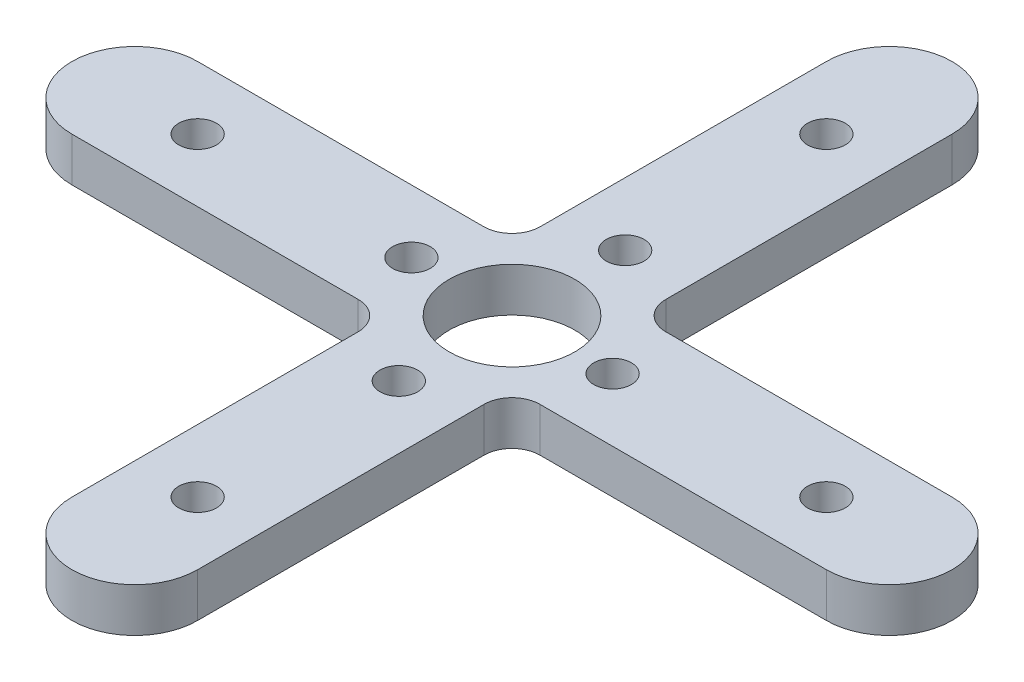
ISO-10303-21;
HEADER;
FILE_DESCRIPTION(('STEP AP214'),'2;1');
FILE_NAME('part.step','',(''),(''),'','','');
FILE_SCHEMA(('AUTOMOTIVE_DESIGN { 1 0 10303 214 1 1 1 1 }'));
ENDSEC;
DATA;
#1=APPLICATION_CONTEXT('core data for automotive mechanical design processes');
#2=APPLICATION_PROTOCOL_DEFINITION('international standard','automotive_design',2000,#1);
#3=PRODUCT_CONTEXT('',#1,'mechanical');
#4=PRODUCT('Part','Part','',(#3));
#5=PRODUCT_RELATED_PRODUCT_CATEGORY('part','',(#4));
#6=PRODUCT_DEFINITION_FORMATION('','',#4);
#7=PRODUCT_DEFINITION_CONTEXT('part definition',#1,'design');
#8=PRODUCT_DEFINITION('design','',#6,#7);
#9=PRODUCT_DEFINITION_SHAPE('','',#8);
#10=(LENGTH_UNIT() NAMED_UNIT(*) SI_UNIT(.MILLI.,.METRE.));
#11=(NAMED_UNIT(*) PLANE_ANGLE_UNIT() SI_UNIT($,.RADIAN.));
#12=(NAMED_UNIT(*) SI_UNIT($,.STERADIAN.) SOLID_ANGLE_UNIT());
#13=UNCERTAINTY_MEASURE_WITH_UNIT(LENGTH_MEASURE(1.E-05),#10,'distance_accuracy_value','');
#14=(GEOMETRIC_REPRESENTATION_CONTEXT(3) GLOBAL_UNCERTAINTY_ASSIGNED_CONTEXT((#13)) GLOBAL_UNIT_ASSIGNED_CONTEXT((#10,
#11,#12)) REPRESENTATION_CONTEXT('',''));
#15=CARTESIAN_POINT('',(0.,0.,0.));
#16=DIRECTION('',(0.,0.,1.));
#17=DIRECTION('',(1.,0.,0.));
#18=AXIS2_PLACEMENT_3D('',#15,#16,#17);
#19=CARTESIAN_POINT('',(1.47572531971469,3.5,0.));
#20=DIRECTION('',(1.,0.,0.));
#21=DIRECTION('',(0.,0.,-1.));
#22=AXIS2_PLACEMENT_3D('',#19,#20,#21);
#23=PLANE('',#22);
#24=DIRECTION('',(0.,0.,1.));
#25=VECTOR('',#24,1.);
#26=CARTESIAN_POINT('',(1.47572531971469,0.,0.));
#27=LINE('',#26,#25);
#28=CARTESIAN_POINT('',(1.47572531971468,0.,10.7886740611654));
#29=VERTEX_POINT('',#28);
#30=CARTESIAN_POINT('',(1.47572531971468,0.,33.5464556338722));
#31=VERTEX_POINT('',#30);
#32=EDGE_CURVE('E211',#29,#31,#27,.T.);
#33=ORIENTED_EDGE('',*,*,#32,.T.);
#34=DIRECTION('',(0.,-1.,0.));
#35=VECTOR('',#34,1.);
#36=CARTESIAN_POINT('',(1.47572531971468,3.5,33.5464556338722));
#37=LINE('',#36,#35);
#38=CARTESIAN_POINT('',(1.47572531971468,3.5,33.5464556338722));
#39=VERTEX_POINT('',#38);
#40=EDGE_CURVE('E11',#39,#31,#37,.T.);
#41=ORIENTED_EDGE('',*,*,#40,.F.);
#42=DIRECTION('',(0.,0.,1.));
#43=VECTOR('',#42,1.);
#44=CARTESIAN_POINT('',(1.47572531971469,3.5,0.));
#45=LINE('',#44,#43);
#46=CARTESIAN_POINT('',(1.47572531971468,3.5,10.7886740611654));
#47=VERTEX_POINT('',#46);
#48=EDGE_CURVE('E325',#47,#39,#45,.T.);
#49=ORIENTED_EDGE('',*,*,#48,.F.);
#50=DIRECTION('',(0.,-1.,0.));
#51=VECTOR('',#50,1.);
#52=CARTESIAN_POINT('',(1.47572531971468,3.5,10.7886740611654));
#53=LINE('',#52,#51);
#54=EDGE_CURVE('E180',#47,#29,#53,.T.);
#55=ORIENTED_EDGE('',*,*,#54,.T.);
#56=EDGE_LOOP('',(#33,#41,#49,#55));
#57=FACE_BOUND('',#56,.T.);
#58=ADVANCED_FACE('F39',(#57),#23,.F.);
#59=CARTESIAN_POINT('',(6.47572531971468,3.5,33.5464556338722));
#60=DIRECTION('',(0.,-1.,0.));
#61=DIRECTION('',(0.,0.,-1.));
#62=AXIS2_PLACEMENT_3D('',#59,#60,#61);
#63=CYLINDRICAL_SURFACE('',#62,5.);
#64=CARTESIAN_POINT('',(6.47572531971468,0.,33.5464556338722));
#65=DIRECTION('',(0.,1.,0.));
#66=DIRECTION('',(0.,0.,1.));
#67=AXIS2_PLACEMENT_3D('',#64,#65,#66);
#68=CIRCLE('',#67,5.);
#69=CARTESIAN_POINT('',(11.4757253197147,0.,33.5464556338722));
#70=VERTEX_POINT('',#69);
#71=EDGE_CURVE('E214',#31,#70,#68,.T.);
#72=ORIENTED_EDGE('',*,*,#71,.T.);
#73=DIRECTION('',(0.,-1.,0.));
#74=VECTOR('',#73,1.);
#75=CARTESIAN_POINT('',(11.4757253197147,3.5,33.5464556338722));
#76=LINE('',#75,#74);
#77=CARTESIAN_POINT('',(11.4757253197147,3.5,33.5464556338722));
#78=VERTEX_POINT('',#77);
#79=EDGE_CURVE('E48',#78,#70,#76,.T.);
#80=ORIENTED_EDGE('',*,*,#79,.F.);
#81=CARTESIAN_POINT('',(6.47572531971468,3.5,33.5464556338722));
#82=DIRECTION('',(0.,1.,0.));
#83=DIRECTION('',(0.,0.,1.));
#84=AXIS2_PLACEMENT_3D('',#81,#82,#83);
#85=CIRCLE('',#84,5.);
#86=EDGE_CURVE('E123',#39,#78,#85,.T.);
#87=ORIENTED_EDGE('',*,*,#86,.F.);
#88=ORIENTED_EDGE('',*,*,#40,.T.);
#89=EDGE_LOOP('',(#72,#80,#87,#88));
#90=FACE_BOUND('',#89,.T.);
#91=ADVANCED_FACE('F340',(#90),#63,.T.);
#92=CARTESIAN_POINT('',(11.4757253197147,3.5,0.));
#93=DIRECTION('',(-1.,0.,0.));
#94=DIRECTION('',(0.,0.,1.));
#95=AXIS2_PLACEMENT_3D('',#92,#93,#94);
#96=PLANE('',#95);
#97=DIRECTION('',(0.,0.,-1.));
#98=VECTOR('',#97,1.);
#99=CARTESIAN_POINT('',(11.4757253197147,0.,0.));
#100=LINE('',#99,#98);
#101=CARTESIAN_POINT('',(11.4757253197147,0.,10.7886740611654));
#102=VERTEX_POINT('',#101);
#103=EDGE_CURVE('E216',#70,#102,#100,.T.);
#104=ORIENTED_EDGE('',*,*,#103,.T.);
#105=DIRECTION('',(0.,-1.,0.));
#106=VECTOR('',#105,1.);
#107=CARTESIAN_POINT('',(11.4757253197147,3.5,10.7886740611654));
#108=LINE('',#107,#106);
#109=CARTESIAN_POINT('',(11.4757253197147,3.5,10.7886740611654));
#110=VERTEX_POINT('',#109);
#111=EDGE_CURVE('E274',#110,#102,#108,.T.);
#112=ORIENTED_EDGE('',*,*,#111,.F.);
#113=DIRECTION('',(0.,0.,-1.));
#114=VECTOR('',#113,1.);
#115=CARTESIAN_POINT('',(11.4757253197147,3.5,0.));
#116=LINE('',#115,#114);
#117=EDGE_CURVE('E281',#78,#110,#116,.T.);
#118=ORIENTED_EDGE('',*,*,#117,.F.);
#119=ORIENTED_EDGE('',*,*,#79,.T.);
#120=EDGE_LOOP('',(#104,#112,#118,#119));
#121=FACE_BOUND('',#120,.T.);
#122=ADVANCED_FACE('F279',(#121),#96,.F.);
#123=CARTESIAN_POINT('',(13.6976972523665,3.5,10.7685189761164));
#124=DIRECTION('',(0.,-1.,0.));
#125=DIRECTION('',(0.,0.,-1.));
#126=AXIS2_PLACEMENT_3D('',#123,#124,#125);
#127=CYLINDRICAL_SURFACE('',#126,2.22206334224426);
#128=CARTESIAN_POINT('',(13.6976972523665,0.,10.7685189761164));
#129=DIRECTION('',(0.,1.,0.));
#130=DIRECTION('',(0.,0.,1.));
#131=AXIS2_PLACEMENT_3D('',#128,#129,#130);
#132=CIRCLE('',#131,2.22206334224426);
#133=CARTESIAN_POINT('',(13.6976972523665,0.,8.54645563387217));
#134=VERTEX_POINT('',#133);
#135=EDGE_CURVE('E219',#134,#102,#132,.T.);
#136=ORIENTED_EDGE('',*,*,#135,.F.);
#137=DIRECTION('',(0.,-1.,0.));
#138=VECTOR('',#137,1.);
#139=CARTESIAN_POINT('',(13.6976972523665,3.5,8.54645563387217));
#140=LINE('',#139,#138);
#141=CARTESIAN_POINT('',(13.6976972523665,3.5,8.54645563387217));
#142=VERTEX_POINT('',#141);
#143=EDGE_CURVE('E272',#142,#134,#140,.T.);
#144=ORIENTED_EDGE('',*,*,#143,.F.);
#145=CARTESIAN_POINT('',(13.6976972523665,3.5,10.7685189761164));
#146=DIRECTION('',(0.,1.,0.));
#147=DIRECTION('',(0.,0.,1.));
#148=AXIS2_PLACEMENT_3D('',#145,#146,#147);
#149=CIRCLE('',#148,2.22206334224426);
#150=EDGE_CURVE('E293',#142,#110,#149,.T.);
#151=ORIENTED_EDGE('',*,*,#150,.T.);
#152=ORIENTED_EDGE('',*,*,#111,.T.);
#153=EDGE_LOOP('',(#136,#144,#151,#152));
#154=FACE_BOUND('',#153,.T.);
#155=ADVANCED_FACE('F289',(#154),#127,.F.);
#156=CARTESIAN_POINT('',(0.,3.5,8.54645563387217));
#157=DIRECTION('',(0.,0.,-1.));
#158=DIRECTION('',(-1.,0.,0.));
#159=AXIS2_PLACEMENT_3D('',#156,#157,#158);
#160=PLANE('',#159);
#161=DIRECTION('',(1.,0.,0.));
#162=VECTOR('',#161,1.);
#163=CARTESIAN_POINT('',(0.,0.,8.54645563387217));
#164=LINE('',#163,#162);
#165=CARTESIAN_POINT('',(36.4757253197147,0.,8.54645563387217));
#166=VERTEX_POINT('',#165);
#167=EDGE_CURVE('E222',#134,#166,#164,.T.);
#168=ORIENTED_EDGE('',*,*,#167,.T.);
#169=DIRECTION('',(0.,-1.,0.));
#170=VECTOR('',#169,1.);
#171=CARTESIAN_POINT('',(36.4757253197147,3.5,8.54645563387217));
#172=LINE('',#171,#170);
#173=CARTESIAN_POINT('',(36.4757253197147,3.5,8.54645563387217));
#174=VERTEX_POINT('',#173);
#175=EDGE_CURVE('E269',#174,#166,#172,.T.);
#176=ORIENTED_EDGE('',*,*,#175,.F.);
#177=DIRECTION('',(1.,0.,0.));
#178=VECTOR('',#177,1.);
#179=CARTESIAN_POINT('',(0.,3.5,8.54645563387217));
#180=LINE('',#179,#178);
#181=EDGE_CURVE('E294',#142,#174,#180,.T.);
#182=ORIENTED_EDGE('',*,*,#181,.F.);
#183=ORIENTED_EDGE('',*,*,#143,.T.);
#184=EDGE_LOOP('',(#168,#176,#182,#183));
#185=FACE_BOUND('',#184,.T.);
#186=ADVANCED_FACE('F566',(#185),#160,.F.);
#187=CARTESIAN_POINT('',(36.4757253197147,3.5,3.54645563387217));
#188=DIRECTION('',(0.,-1.,0.));
#189=DIRECTION('',(0.,0.,-1.));
#190=AXIS2_PLACEMENT_3D('',#187,#188,#189);
#191=CYLINDRICAL_SURFACE('',#190,5.);
#192=CARTESIAN_POINT('',(36.4757253197147,0.,3.54645563387217));
#193=DIRECTION('',(0.,1.,0.));
#194=DIRECTION('',(0.,0.,1.));
#195=AXIS2_PLACEMENT_3D('',#192,#193,#194);
#196=CIRCLE('',#195,5.);
#197=CARTESIAN_POINT('',(36.4757253197147,0.,-1.45354436612783));
#198=VERTEX_POINT('',#197);
#199=EDGE_CURVE('E224',#166,#198,#196,.T.);
#200=ORIENTED_EDGE('',*,*,#199,.T.);
#201=DIRECTION('',(0.,-1.,0.));
#202=VECTOR('',#201,1.);
#203=CARTESIAN_POINT('',(36.4757253197147,3.5,-1.45354436612783));
#204=LINE('',#203,#202);
#205=CARTESIAN_POINT('',(36.4757253197147,3.5,-1.45354436612783));
#206=VERTEX_POINT('',#205);
#207=EDGE_CURVE('E267',#206,#198,#204,.T.);
#208=ORIENTED_EDGE('',*,*,#207,.F.);
#209=CARTESIAN_POINT('',(36.4757253197147,3.5,3.54645563387217));
#210=DIRECTION('',(0.,1.,0.));
#211=DIRECTION('',(0.,0.,1.));
#212=AXIS2_PLACEMENT_3D('',#209,#210,#211);
#213=CIRCLE('',#212,5.);
#214=EDGE_CURVE('E296',#174,#206,#213,.T.);
#215=ORIENTED_EDGE('',*,*,#214,.F.);
#216=ORIENTED_EDGE('',*,*,#175,.T.);
#217=EDGE_LOOP('',(#200,#208,#215,#216));
#218=FACE_BOUND('',#217,.T.);
#219=ADVANCED_FACE('F556',(#218),#191,.T.);
#220=CARTESIAN_POINT('',(0.,3.5,-1.45354436612783));
#221=DIRECTION('',(0.,0.,-1.));
#222=DIRECTION('',(-1.,0.,0.));
#223=AXIS2_PLACEMENT_3D('',#220,#221,#222);
#224=PLANE('',#223);
#225=DIRECTION('',(1.,0.,0.));
#226=VECTOR('',#225,1.);
#227=CARTESIAN_POINT('',(0.,0.,-1.45354436612783));
#228=LINE('',#227,#226);
#229=CARTESIAN_POINT('',(13.6976972523665,0.,-1.45354436612783));
#230=VERTEX_POINT('',#229);
#231=EDGE_CURVE('E227',#230,#198,#228,.T.);
#232=ORIENTED_EDGE('',*,*,#231,.F.);
#233=DIRECTION('',(0.,-1.,0.));
#234=VECTOR('',#233,1.);
#235=CARTESIAN_POINT('',(13.6976972523665,3.5,-1.45354436612783));
#236=LINE('',#235,#234);
#237=CARTESIAN_POINT('',(13.6976972523665,3.5,-1.45354436612783));
#238=VERTEX_POINT('',#237);
#239=EDGE_CURVE('E265',#238,#230,#236,.T.);
#240=ORIENTED_EDGE('',*,*,#239,.F.);
#241=DIRECTION('',(1.,0.,0.));
#242=VECTOR('',#241,1.);
#243=CARTESIAN_POINT('',(0.,3.5,-1.45354436612783));
#244=LINE('',#243,#242);
#245=EDGE_CURVE('E302',#238,#206,#244,.T.);
#246=ORIENTED_EDGE('',*,*,#245,.T.);
#247=ORIENTED_EDGE('',*,*,#207,.T.);
#248=EDGE_LOOP('',(#232,#240,#246,#247));
#249=FACE_BOUND('',#248,.T.);
#250=ADVANCED_FACE('F546',(#249),#224,.T.);
#251=CARTESIAN_POINT('',(13.6976972523665,3.5,-3.67560770837209));
#252=DIRECTION('',(0.,-1.,0.));
#253=DIRECTION('',(0.,0.,-1.));
#254=AXIS2_PLACEMENT_3D('',#251,#252,#253);
#255=CYLINDRICAL_SURFACE('',#254,2.22206334224426);
#256=CARTESIAN_POINT('',(13.6976972523665,0.,-3.67560770837209));
#257=DIRECTION('',(0.,1.,0.));
#258=DIRECTION('',(0.,0.,1.));
#259=AXIS2_PLACEMENT_3D('',#256,#257,#258);
#260=CIRCLE('',#259,2.22206334224426);
#261=CARTESIAN_POINT('',(11.4757253197147,0.,-3.6957627934212));
#262=VERTEX_POINT('',#261);
#263=EDGE_CURVE('E230',#262,#230,#260,.T.);
#264=ORIENTED_EDGE('',*,*,#263,.F.);
#265=DIRECTION('',(0.,-1.,0.));
#266=VECTOR('',#265,1.);
#267=CARTESIAN_POINT('',(11.4757253197147,3.5,-3.6957627934212));
#268=LINE('',#267,#266);
#269=CARTESIAN_POINT('',(11.4757253197147,3.5,-3.6957627934212));
#270=VERTEX_POINT('',#269);
#271=EDGE_CURVE('E263',#270,#262,#268,.T.);
#272=ORIENTED_EDGE('',*,*,#271,.F.);
#273=CARTESIAN_POINT('',(13.6976972523665,3.5,-3.67560770837209));
#274=DIRECTION('',(0.,1.,0.));
#275=DIRECTION('',(0.,0.,1.));
#276=AXIS2_PLACEMENT_3D('',#273,#274,#275);
#277=CIRCLE('',#276,2.22206334224426);
#278=EDGE_CURVE('E305',#270,#238,#277,.T.);
#279=ORIENTED_EDGE('',*,*,#278,.T.);
#280=ORIENTED_EDGE('',*,*,#239,.T.);
#281=EDGE_LOOP('',(#264,#272,#279,#280));
#282=FACE_BOUND('',#281,.T.);
#283=ADVANCED_FACE('F536',(#282),#255,.F.);
#284=CARTESIAN_POINT('',(11.4757253197147,3.5,0.));
#285=DIRECTION('',(1.,0.,0.));
#286=DIRECTION('',(0.,0.,-1.));
#287=AXIS2_PLACEMENT_3D('',#284,#285,#286);
#288=PLANE('',#287);
#289=DIRECTION('',(0.,0.,1.));
#290=VECTOR('',#289,1.);
#291=CARTESIAN_POINT('',(11.4757253197147,0.,0.));
#292=LINE('',#291,#290);
#293=CARTESIAN_POINT('',(11.4757253197147,0.,-26.4535443661278));
#294=VERTEX_POINT('',#293);
#295=EDGE_CURVE('E233',#294,#262,#292,.T.);
#296=ORIENTED_EDGE('',*,*,#295,.F.);
#297=DIRECTION('',(0.,-1.,0.));
#298=VECTOR('',#297,1.);
#299=CARTESIAN_POINT('',(11.4757253197147,3.5,-26.4535443661278));
#300=LINE('',#299,#298);
#301=CARTESIAN_POINT('',(11.4757253197147,3.5,-26.4535443661278));
#302=VERTEX_POINT('',#301);
#303=EDGE_CURVE('E261',#302,#294,#300,.T.);
#304=ORIENTED_EDGE('',*,*,#303,.F.);
#305=DIRECTION('',(0.,0.,1.));
#306=VECTOR('',#305,1.);
#307=CARTESIAN_POINT('',(11.4757253197147,3.5,0.));
#308=LINE('',#307,#306);
#309=EDGE_CURVE('E308',#302,#270,#308,.T.);
#310=ORIENTED_EDGE('',*,*,#309,.T.);
#311=ORIENTED_EDGE('',*,*,#271,.T.);
#312=EDGE_LOOP('',(#296,#304,#310,#311));
#313=FACE_BOUND('',#312,.T.);
#314=ADVANCED_FACE('F526',(#313),#288,.T.);
#315=CARTESIAN_POINT('',(6.47572531971468,3.5,-26.4535443661278));
#316=DIRECTION('',(0.,-1.,0.));
#317=DIRECTION('',(0.,0.,-1.));
#318=AXIS2_PLACEMENT_3D('',#315,#316,#317);
#319=CYLINDRICAL_SURFACE('',#318,5.);
#320=CARTESIAN_POINT('',(6.47572531971468,0.,-26.4535443661278));
#321=DIRECTION('',(0.,1.,0.));
#322=DIRECTION('',(0.,0.,1.));
#323=AXIS2_PLACEMENT_3D('',#320,#321,#322);
#324=CIRCLE('',#323,5.);
#325=CARTESIAN_POINT('',(1.47572531971468,0.,-26.4535443661278));
#326=VERTEX_POINT('',#325);
#327=EDGE_CURVE('E236',#294,#326,#324,.T.);
#328=ORIENTED_EDGE('',*,*,#327,.T.);
#329=DIRECTION('',(0.,-1.,0.));
#330=VECTOR('',#329,1.);
#331=CARTESIAN_POINT('',(1.47572531971468,3.5,-26.4535443661278));
#332=LINE('',#331,#330);
#333=CARTESIAN_POINT('',(1.47572531971468,3.5,-26.4535443661278));
#334=VERTEX_POINT('',#333);
#335=EDGE_CURVE('E259',#334,#326,#332,.T.);
#336=ORIENTED_EDGE('',*,*,#335,.F.);
#337=CARTESIAN_POINT('',(6.47572531971468,3.5,-26.4535443661278));
#338=DIRECTION('',(0.,1.,0.));
#339=DIRECTION('',(0.,0.,1.));
#340=AXIS2_PLACEMENT_3D('',#337,#338,#339);
#341=CIRCLE('',#340,5.);
#342=EDGE_CURVE('E311',#302,#334,#341,.T.);
#343=ORIENTED_EDGE('',*,*,#342,.F.);
#344=ORIENTED_EDGE('',*,*,#303,.T.);
#345=EDGE_LOOP('',(#328,#336,#343,#344));
#346=FACE_BOUND('',#345,.T.);
#347=ADVANCED_FACE('F515',(#346),#319,.T.);
#348=CARTESIAN_POINT('',(1.47572531971468,3.5,0.));
#349=DIRECTION('',(-1.,0.,0.));
#350=DIRECTION('',(0.,0.,1.));
#351=AXIS2_PLACEMENT_3D('',#348,#349,#350);
#352=PLANE('',#351);
#353=DIRECTION('',(0.,0.,-1.));
#354=VECTOR('',#353,1.);
#355=CARTESIAN_POINT('',(1.47572531971468,0.,0.));
#356=LINE('',#355,#354);
#357=CARTESIAN_POINT('',(1.47572531971468,0.,-3.69576279342108));
#358=VERTEX_POINT('',#357);
#359=EDGE_CURVE('E239',#358,#326,#356,.T.);
#360=ORIENTED_EDGE('',*,*,#359,.F.);
#361=DIRECTION('',(0.,-1.,0.));
#362=VECTOR('',#361,1.);
#363=CARTESIAN_POINT('',(1.47572531971468,3.5,-3.69576279342108));
#364=LINE('',#363,#362);
#365=CARTESIAN_POINT('',(1.47572531971468,3.5,-3.69576279342108));
#366=VERTEX_POINT('',#365);
#367=EDGE_CURVE('E257',#366,#358,#364,.T.);
#368=ORIENTED_EDGE('',*,*,#367,.F.);
#369=DIRECTION('',(0.,0.,-1.));
#370=VECTOR('',#369,1.);
#371=CARTESIAN_POINT('',(1.47572531971468,3.5,0.));
#372=LINE('',#371,#370);
#373=EDGE_CURVE('E313',#366,#334,#372,.T.);
#374=ORIENTED_EDGE('',*,*,#373,.T.);
#375=ORIENTED_EDGE('',*,*,#335,.T.);
#376=EDGE_LOOP('',(#360,#368,#374,#375));
#377=FACE_BOUND('',#376,.T.);
#378=ADVANCED_FACE('F505',(#377),#352,.T.);
#379=CARTESIAN_POINT('',(-0.766493107578561,3.5,-3.69576279342108));
#380=DIRECTION('',(0.,-1.,0.));
#381=DIRECTION('',(0.,0.,-1.));
#382=AXIS2_PLACEMENT_3D('',#379,#380,#381);
#383=CYLINDRICAL_SURFACE('',#382,2.24221842729325);
#384=CARTESIAN_POINT('',(-0.766493107578561,0.,-3.69576279342108));
#385=DIRECTION('',(0.,1.,0.));
#386=DIRECTION('',(0.,0.,1.));
#387=AXIS2_PLACEMENT_3D('',#384,#385,#386);
#388=CIRCLE('',#387,2.24221842729325);
#389=CARTESIAN_POINT('',(-0.766493107578561,0.,-1.45354436612783));
#390=VERTEX_POINT('',#389);
#391=EDGE_CURVE('E242',#390,#358,#388,.T.);
#392=ORIENTED_EDGE('',*,*,#391,.F.);
#393=DIRECTION('',(0.,-1.,0.));
#394=VECTOR('',#393,1.);
#395=CARTESIAN_POINT('',(-0.766493107578561,3.5,-1.45354436612783));
#396=LINE('',#395,#394);
#397=CARTESIAN_POINT('',(-0.766493107578561,3.5,-1.45354436612783));
#398=VERTEX_POINT('',#397);
#399=EDGE_CURVE('E255',#398,#390,#396,.T.);
#400=ORIENTED_EDGE('',*,*,#399,.F.);
#401=CARTESIAN_POINT('',(-0.766493107578561,3.5,-3.69576279342108));
#402=DIRECTION('',(0.,1.,0.));
#403=DIRECTION('',(0.,0.,1.));
#404=AXIS2_PLACEMENT_3D('',#401,#402,#403);
#405=CIRCLE('',#404,2.24221842729325);
#406=EDGE_CURVE('E316',#398,#366,#405,.T.);
#407=ORIENTED_EDGE('',*,*,#406,.T.);
#408=ORIENTED_EDGE('',*,*,#367,.T.);
#409=EDGE_LOOP('',(#392,#400,#407,#408));
#410=FACE_BOUND('',#409,.T.);
#411=ADVANCED_FACE('F496',(#410),#383,.F.);
#412=CARTESIAN_POINT('',(0.,3.5,-1.45354436612783));
#413=DIRECTION('',(0.,0.,-1.));
#414=DIRECTION('',(-1.,0.,0.));
#415=AXIS2_PLACEMENT_3D('',#412,#413,#414);
#416=PLANE('',#415);
#417=DIRECTION('',(1.,0.,0.));
#418=VECTOR('',#417,1.);
#419=CARTESIAN_POINT('',(0.,0.,-1.45354436612783));
#420=LINE('',#419,#418);
#421=CARTESIAN_POINT('',(-23.5242746802853,0.,-1.45354436612783));
#422=VERTEX_POINT('',#421);
#423=EDGE_CURVE('E245',#422,#390,#420,.T.);
#424=ORIENTED_EDGE('',*,*,#423,.F.);
#425=DIRECTION('',(0.,-1.,0.));
#426=VECTOR('',#425,1.);
#427=CARTESIAN_POINT('',(-23.5242746802853,3.5,-1.45354436612783));
#428=LINE('',#427,#426);
#429=CARTESIAN_POINT('',(-23.5242746802853,3.5,-1.45354436612783));
#430=VERTEX_POINT('',#429);
#431=EDGE_CURVE('E175',#430,#422,#428,.T.);
#432=ORIENTED_EDGE('',*,*,#431,.F.);
#433=DIRECTION('',(1.,0.,0.));
#434=VECTOR('',#433,1.);
#435=CARTESIAN_POINT('',(0.,3.5,-1.45354436612783));
#436=LINE('',#435,#434);
#437=EDGE_CURVE('E168',#430,#398,#436,.T.);
#438=ORIENTED_EDGE('',*,*,#437,.T.);
#439=ORIENTED_EDGE('',*,*,#399,.T.);
#440=EDGE_LOOP('',(#424,#432,#438,#439));
#441=FACE_BOUND('',#440,.T.);
#442=ADVANCED_FACE('F320',(#441),#416,.T.);
#443=CARTESIAN_POINT('',(-23.5242746802853,3.5,3.54645563387217));
#444=DIRECTION('',(0.,-1.,0.));
#445=DIRECTION('',(0.,0.,-1.));
#446=AXIS2_PLACEMENT_3D('',#443,#444,#445);
#447=CYLINDRICAL_SURFACE('',#446,5.);
#448=CARTESIAN_POINT('',(-23.5242746802853,0.,3.54645563387217));
#449=DIRECTION('',(0.,1.,0.));
#450=DIRECTION('',(0.,0.,1.));
#451=AXIS2_PLACEMENT_3D('',#448,#449,#450);
#452=CIRCLE('',#451,5.);
#453=CARTESIAN_POINT('',(-23.5242746802853,0.,8.54645563387217));
#454=VERTEX_POINT('',#453);
#455=EDGE_CURVE('E174',#422,#454,#452,.T.);
#456=ORIENTED_EDGE('',*,*,#455,.T.);
#457=DIRECTION('',(0.,-1.,0.));
#458=VECTOR('',#457,1.);
#459=CARTESIAN_POINT('',(-23.5242746802853,3.5,8.54645563387217));
#460=LINE('',#459,#458);
#461=CARTESIAN_POINT('',(-23.5242746802853,3.5,8.54645563387217));
#462=VERTEX_POINT('',#461);
#463=EDGE_CURVE('E171',#462,#454,#460,.T.);
#464=ORIENTED_EDGE('',*,*,#463,.F.);
#465=CARTESIAN_POINT('',(-23.5242746802853,3.5,3.54645563387217));
#466=DIRECTION('',(0.,1.,0.));
#467=DIRECTION('',(0.,0.,1.));
#468=AXIS2_PLACEMENT_3D('',#465,#466,#467);
#469=CIRCLE('',#468,5.);
#470=EDGE_CURVE('E161',#430,#462,#469,.T.);
#471=ORIENTED_EDGE('',*,*,#470,.F.);
#472=ORIENTED_EDGE('',*,*,#431,.T.);
#473=EDGE_LOOP('',(#456,#464,#471,#472));
#474=FACE_BOUND('',#473,.T.);
#475=ADVANCED_FACE('F172',(#474),#447,.T.);
#476=CARTESIAN_POINT('',(0.,3.5,8.54645563387217));
#477=DIRECTION('',(0.,0.,-1.));
#478=DIRECTION('',(-1.,0.,0.));
#479=AXIS2_PLACEMENT_3D('',#476,#477,#478);
#480=PLANE('',#479);
#481=DIRECTION('',(1.,0.,0.));
#482=VECTOR('',#481,1.);
#483=CARTESIAN_POINT('',(0.,0.,8.54645563387217));
#484=LINE('',#483,#482);
#485=CARTESIAN_POINT('',(-0.766493107578561,0.,8.54645563387217));
#486=VERTEX_POINT('',#485);
#487=EDGE_CURVE('E109',#454,#486,#484,.T.);
#488=ORIENTED_EDGE('',*,*,#487,.T.);
#489=DIRECTION('',(0.,-1.,0.));
#490=VECTOR('',#489,1.);
#491=CARTESIAN_POINT('',(-0.766493107578561,3.5,8.54645563387217));
#492=LINE('',#491,#490);
#493=CARTESIAN_POINT('',(-0.766493107578561,3.5,8.54645563387217));
#494=VERTEX_POINT('',#493);
#495=EDGE_CURVE('E176',#494,#486,#492,.T.);
#496=ORIENTED_EDGE('',*,*,#495,.F.);
#497=DIRECTION('',(1.,0.,0.));
#498=VECTOR('',#497,1.);
#499=CARTESIAN_POINT('',(0.,3.5,8.54645563387217));
#500=LINE('',#499,#498);
#501=EDGE_CURVE('E165',#462,#494,#500,.T.);
#502=ORIENTED_EDGE('',*,*,#501,.F.);
#503=ORIENTED_EDGE('',*,*,#463,.T.);
#504=EDGE_LOOP('',(#488,#496,#502,#503));
#505=FACE_BOUND('',#504,.T.);
#506=ADVANCED_FACE('F178',(#505),#480,.F.);
#507=CARTESIAN_POINT('',(6.47572531971469,3.5,3.54645563387217));
#508=DIRECTION('',(0.,-1.,0.));
#509=DIRECTION('',(0.,0.,-1.));
#510=AXIS2_PLACEMENT_3D('',#507,#508,#509);
#511=CYLINDRICAL_SURFACE('',#510,5.);
#512=CARTESIAN_POINT('',(6.47572531971469,3.5,3.54645563387217));
#513=DIRECTION('',(0.,1.,0.));
#514=DIRECTION('',(0.,0.,1.));
#515=AXIS2_PLACEMENT_3D('',#512,#513,#514);
#516=CIRCLE('',#515,5.);
#517=CARTESIAN_POINT('',(6.47572531971469,3.5,8.54645563387217));
#518=VERTEX_POINT('',#517);
#519=EDGE_CURVE('E652',#518,#518,#516,.T.);
#520=ORIENTED_EDGE('',*,*,#519,.T.);
#521=EDGE_LOOP('',(#520));
#522=FACE_BOUND('',#521,.T.);
#523=CARTESIAN_POINT('',(6.47572531971469,0.,3.54645563387217));
#524=DIRECTION('',(0.,1.,0.));
#525=DIRECTION('',(0.,0.,1.));
#526=AXIS2_PLACEMENT_3D('',#523,#524,#525);
#527=CIRCLE('',#526,5.);
#528=CARTESIAN_POINT('',(6.47572531971469,0.,8.54645563387217));
#529=VERTEX_POINT('',#528);
#530=EDGE_CURVE('E208',#529,#529,#527,.T.);
#531=ORIENTED_EDGE('',*,*,#530,.F.);
#532=EDGE_LOOP('',(#531));
#533=FACE_BOUND('',#532,.T.);
#534=ADVANCED_FACE('F348',(#522,#533),#511,.F.);
#535=CARTESIAN_POINT('',(-1.52427468028531,3.5,3.54645563387217));
#536=DIRECTION('',(0.,-1.,0.));
#537=DIRECTION('',(0.,0.,-1.));
#538=AXIS2_PLACEMENT_3D('',#535,#536,#537);
#539=CYLINDRICAL_SURFACE('',#538,1.5);
#540=CARTESIAN_POINT('',(-1.52427468028531,3.5,3.54645563387217));
#541=DIRECTION('',(0.,1.,0.));
#542=DIRECTION('',(0.,0.,1.));
#543=AXIS2_PLACEMENT_3D('',#540,#541,#542);
#544=CIRCLE('',#543,1.5);
#545=CARTESIAN_POINT('',(-1.52427468028531,3.5,5.04645563387217));
#546=VERTEX_POINT('',#545);
#547=EDGE_CURVE('E649',#546,#546,#544,.T.);
#548=ORIENTED_EDGE('',*,*,#547,.T.);
#549=EDGE_LOOP('',(#548));
#550=FACE_BOUND('',#549,.T.);
#551=CARTESIAN_POINT('',(-1.52427468028531,0.,3.54645563387217));
#552=DIRECTION('',(0.,1.,0.));
#553=DIRECTION('',(0.,0.,1.));
#554=AXIS2_PLACEMENT_3D('',#551,#552,#553);
#555=CIRCLE('',#554,1.5);
#556=CARTESIAN_POINT('',(-1.52427468028531,0.,5.04645563387217));
#557=VERTEX_POINT('',#556);
#558=EDGE_CURVE('E205',#557,#557,#555,.T.);
#559=ORIENTED_EDGE('',*,*,#558,.F.);
#560=EDGE_LOOP('',(#559));
#561=FACE_BOUND('',#560,.T.);
#562=ADVANCED_FACE('F351',(#550,#561),#539,.F.);
#563=CARTESIAN_POINT('',(14.4757253197147,3.5,3.54645563387217));
#564=DIRECTION('',(0.,-1.,0.));
#565=DIRECTION('',(0.,0.,-1.));
#566=AXIS2_PLACEMENT_3D('',#563,#564,#565);
#567=CYLINDRICAL_SURFACE('',#566,1.5);
#568=CARTESIAN_POINT('',(14.4757253197147,3.5,3.54645563387217));
#569=DIRECTION('',(0.,1.,0.));
#570=DIRECTION('',(0.,0.,1.));
#571=AXIS2_PLACEMENT_3D('',#568,#569,#570);
#572=CIRCLE('',#571,1.5);
#573=CARTESIAN_POINT('',(14.4757253197147,3.5,5.04645563387217));
#574=VERTEX_POINT('',#573);
#575=EDGE_CURVE('E646',#574,#574,#572,.T.);
#576=ORIENTED_EDGE('',*,*,#575,.T.);
#577=EDGE_LOOP('',(#576));
#578=FACE_BOUND('',#577,.T.);
#579=CARTESIAN_POINT('',(14.4757253197147,0.,3.54645563387217));
#580=DIRECTION('',(0.,1.,0.));
#581=DIRECTION('',(0.,0.,1.));
#582=AXIS2_PLACEMENT_3D('',#579,#580,#581);
#583=CIRCLE('',#582,1.5);
#584=CARTESIAN_POINT('',(14.4757253197147,0.,5.04645563387217));
#585=VERTEX_POINT('',#584);
#586=EDGE_CURVE('E202',#585,#585,#583,.T.);
#587=ORIENTED_EDGE('',*,*,#586,.F.);
#588=EDGE_LOOP('',(#587));
#589=FACE_BOUND('',#588,.T.);
#590=ADVANCED_FACE('F355',(#578,#589),#567,.F.);
#591=CARTESIAN_POINT('',(-18.5242746802853,3.5,3.54645563387217));
#592=DIRECTION('',(0.,-1.,0.));
#593=DIRECTION('',(0.,0.,-1.));
#594=AXIS2_PLACEMENT_3D('',#591,#592,#593);
#595=CYLINDRICAL_SURFACE('',#594,1.5);
#596=CARTESIAN_POINT('',(-18.5242746802853,3.5,3.54645563387217));
#597=DIRECTION('',(0.,1.,0.));
#598=DIRECTION('',(0.,0.,1.));
#599=AXIS2_PLACEMENT_3D('',#596,#597,#598);
#600=CIRCLE('',#599,1.5);
#601=CARTESIAN_POINT('',(-18.5242746802853,3.5,5.04645563387217));
#602=VERTEX_POINT('',#601);
#603=EDGE_CURVE('E643',#602,#602,#600,.T.);
#604=ORIENTED_EDGE('',*,*,#603,.T.);
#605=EDGE_LOOP('',(#604));
#606=FACE_BOUND('',#605,.T.);
#607=CARTESIAN_POINT('',(-18.5242746802853,0.,3.54645563387217));
#608=DIRECTION('',(0.,1.,0.));
#609=DIRECTION('',(0.,0.,1.));
#610=AXIS2_PLACEMENT_3D('',#607,#608,#609);
#611=CIRCLE('',#610,1.5);
#612=CARTESIAN_POINT('',(-18.5242746802853,0.,5.04645563387217));
#613=VERTEX_POINT('',#612);
#614=EDGE_CURVE('E199',#613,#613,#611,.T.);
#615=ORIENTED_EDGE('',*,*,#614,.F.);
#616=EDGE_LOOP('',(#615));
#617=FACE_BOUND('',#616,.T.);
#618=ADVANCED_FACE('F359',(#606,#617),#595,.F.);
#619=CARTESIAN_POINT('',(6.47572531971469,3.5,-21.4535443661279));
#620=DIRECTION('',(0.,-1.,0.));
#621=DIRECTION('',(0.,0.,-1.));
#622=AXIS2_PLACEMENT_3D('',#619,#620,#621);
#623=CYLINDRICAL_SURFACE('',#622,1.5);
#624=CARTESIAN_POINT('',(6.47572531971469,3.5,-21.4535443661279));
#625=DIRECTION('',(0.,1.,0.));
#626=DIRECTION('',(0.,0.,1.));
#627=AXIS2_PLACEMENT_3D('',#624,#625,#626);
#628=CIRCLE('',#627,1.5);
#629=CARTESIAN_POINT('',(6.47572531971469,3.5,-19.9535443661279));
#630=VERTEX_POINT('',#629);
#631=EDGE_CURVE('E640',#630,#630,#628,.T.);
#632=ORIENTED_EDGE('',*,*,#631,.T.);
#633=EDGE_LOOP('',(#632));
#634=FACE_BOUND('',#633,.T.);
#635=CARTESIAN_POINT('',(6.47572531971469,0.,-21.4535443661279));
#636=DIRECTION('',(0.,1.,0.));
#637=DIRECTION('',(0.,0.,1.));
#638=AXIS2_PLACEMENT_3D('',#635,#636,#637);
#639=CIRCLE('',#638,1.5);
#640=CARTESIAN_POINT('',(6.47572531971469,0.,-19.9535443661279));
#641=VERTEX_POINT('',#640);
#642=EDGE_CURVE('E196',#641,#641,#639,.T.);
#643=ORIENTED_EDGE('',*,*,#642,.F.);
#644=EDGE_LOOP('',(#643));
#645=FACE_BOUND('',#644,.T.);
#646=ADVANCED_FACE('F363',(#634,#645),#623,.F.);
#647=CARTESIAN_POINT('',(31.4757253197147,3.5,3.54645563387213));
#648=DIRECTION('',(0.,-1.,0.));
#649=DIRECTION('',(0.,0.,-1.));
#650=AXIS2_PLACEMENT_3D('',#647,#648,#649);
#651=CYLINDRICAL_SURFACE('',#650,1.5);
#652=CARTESIAN_POINT('',(31.4757253197147,3.5,3.54645563387213));
#653=DIRECTION('',(0.,1.,0.));
#654=DIRECTION('',(0.,0.,1.));
#655=AXIS2_PLACEMENT_3D('',#652,#653,#654);
#656=CIRCLE('',#655,1.5);
#657=CARTESIAN_POINT('',(31.4757253197147,3.5,5.04645563387213));
#658=VERTEX_POINT('',#657);
#659=EDGE_CURVE('E633',#658,#658,#656,.T.);
#660=ORIENTED_EDGE('',*,*,#659,.T.);
#661=EDGE_LOOP('',(#660));
#662=FACE_BOUND('',#661,.T.);
#663=CARTESIAN_POINT('',(31.4757253197147,0.,3.54645563387213));
#664=DIRECTION('',(0.,1.,0.));
#665=DIRECTION('',(0.,0.,1.));
#666=AXIS2_PLACEMENT_3D('',#663,#664,#665);
#667=CIRCLE('',#666,1.5);
#668=CARTESIAN_POINT('',(31.4757253197147,0.,5.04645563387213));
#669=VERTEX_POINT('',#668);
#670=EDGE_CURVE('E193',#669,#669,#667,.T.);
#671=ORIENTED_EDGE('',*,*,#670,.F.);
#672=EDGE_LOOP('',(#671));
#673=FACE_BOUND('',#672,.T.);
#674=ADVANCED_FACE('F367',(#662,#673),#651,.F.);
#675=CARTESIAN_POINT('',(6.47572531971469,3.5,28.5464556338721));
#676=DIRECTION('',(0.,-1.,0.));
#677=DIRECTION('',(0.,0.,-1.));
#678=AXIS2_PLACEMENT_3D('',#675,#676,#677);
#679=CYLINDRICAL_SURFACE('',#678,1.5);
#680=CARTESIAN_POINT('',(6.47572531971469,3.5,28.5464556338721));
#681=DIRECTION('',(0.,1.,0.));
#682=DIRECTION('',(0.,0.,1.));
#683=AXIS2_PLACEMENT_3D('',#680,#681,#682);
#684=CIRCLE('',#683,1.5);
#685=CARTESIAN_POINT('',(6.47572531971469,3.5,30.0464556338721));
#686=VERTEX_POINT('',#685);
#687=EDGE_CURVE('E630',#686,#686,#684,.T.);
#688=ORIENTED_EDGE('',*,*,#687,.T.);
#689=EDGE_LOOP('',(#688));
#690=FACE_BOUND('',#689,.T.);
#691=CARTESIAN_POINT('',(6.47572531971469,0.,28.5464556338721));
#692=DIRECTION('',(0.,1.,0.));
#693=DIRECTION('',(0.,0.,1.));
#694=AXIS2_PLACEMENT_3D('',#691,#692,#693);
#695=CIRCLE('',#694,1.5);
#696=CARTESIAN_POINT('',(6.47572531971469,0.,30.0464556338721));
#697=VERTEX_POINT('',#696);
#698=EDGE_CURVE('E190',#697,#697,#695,.T.);
#699=ORIENTED_EDGE('',*,*,#698,.F.);
#700=EDGE_LOOP('',(#699));
#701=FACE_BOUND('',#700,.T.);
#702=ADVANCED_FACE('F371',(#690,#701),#679,.F.);
#703=CARTESIAN_POINT('',(6.47572531971469,3.5,12.5464556338721));
#704=DIRECTION('',(0.,-1.,0.));
#705=DIRECTION('',(0.,0.,-1.));
#706=AXIS2_PLACEMENT_3D('',#703,#704,#705);
#707=CYLINDRICAL_SURFACE('',#706,1.5);
#708=CARTESIAN_POINT('',(6.47572531971469,3.5,12.5464556338721));
#709=DIRECTION('',(0.,1.,0.));
#710=DIRECTION('',(0.,0.,1.));
#711=AXIS2_PLACEMENT_3D('',#708,#709,#710);
#712=CIRCLE('',#711,1.5);
#713=CARTESIAN_POINT('',(6.47572531971469,3.5,14.0464556338721));
#714=VERTEX_POINT('',#713);
#715=EDGE_CURVE('E382',#714,#714,#712,.T.);
#716=ORIENTED_EDGE('',*,*,#715,.T.);
#717=EDGE_LOOP('',(#716));
#718=FACE_BOUND('',#717,.T.);
#719=CARTESIAN_POINT('',(6.47572531971469,0.,12.5464556338721));
#720=DIRECTION('',(0.,1.,0.));
#721=DIRECTION('',(0.,0.,1.));
#722=AXIS2_PLACEMENT_3D('',#719,#720,#721);
#723=CIRCLE('',#722,1.5);
#724=CARTESIAN_POINT('',(6.47572531971469,0.,14.0464556338721));
#725=VERTEX_POINT('',#724);
#726=EDGE_CURVE('E187',#725,#725,#723,.T.);
#727=ORIENTED_EDGE('',*,*,#726,.F.);
#728=EDGE_LOOP('',(#727));
#729=FACE_BOUND('',#728,.T.);
#730=ADVANCED_FACE('F335',(#718,#729),#707,.F.);
#731=CARTESIAN_POINT('',(6.47572531971469,3.5,-5.45354436612787));
#732=DIRECTION('',(0.,-1.,0.));
#733=DIRECTION('',(0.,0.,-1.));
#734=AXIS2_PLACEMENT_3D('',#731,#732,#733);
#735=CYLINDRICAL_SURFACE('',#734,1.5);
#736=CARTESIAN_POINT('',(6.47572531971469,3.5,-5.45354436612787));
#737=DIRECTION('',(0.,1.,0.));
#738=DIRECTION('',(0.,0.,1.));
#739=AXIS2_PLACEMENT_3D('',#736,#737,#738);
#740=CIRCLE('',#739,1.5);
#741=CARTESIAN_POINT('',(6.47572531971469,3.5,-3.95354436612787));
#742=VERTEX_POINT('',#741);
#743=EDGE_CURVE('E251',#742,#742,#740,.T.);
#744=ORIENTED_EDGE('',*,*,#743,.T.);
#745=EDGE_LOOP('',(#744));
#746=FACE_BOUND('',#745,.T.);
#747=CARTESIAN_POINT('',(6.47572531971469,0.,-5.45354436612787));
#748=DIRECTION('',(0.,1.,0.));
#749=DIRECTION('',(0.,0.,1.));
#750=AXIS2_PLACEMENT_3D('',#747,#748,#749);
#751=CIRCLE('',#750,1.5);
#752=CARTESIAN_POINT('',(6.47572531971469,0.,-3.95354436612787));
#753=VERTEX_POINT('',#752);
#754=EDGE_CURVE('E184',#753,#753,#751,.T.);
#755=ORIENTED_EDGE('',*,*,#754,.F.);
#756=EDGE_LOOP('',(#755));
#757=FACE_BOUND('',#756,.T.);
#758=ADVANCED_FACE('F41',(#746,#757),#735,.F.);
#759=CARTESIAN_POINT('',(-0.766493107578561,3.5,10.7886740611654));
#760=DIRECTION('',(0.,-1.,0.));
#761=DIRECTION('',(0.,0.,-1.));
#762=AXIS2_PLACEMENT_3D('',#759,#760,#761);
#763=CYLINDRICAL_SURFACE('',#762,2.24221842729325);
#764=CARTESIAN_POINT('',(-0.766493107578561,0.,10.7886740611654));
#765=DIRECTION('',(0.,1.,0.));
#766=DIRECTION('',(0.,0.,1.));
#767=AXIS2_PLACEMENT_3D('',#764,#765,#766);
#768=CIRCLE('',#767,2.24221842729325);
#769=EDGE_CURVE('E115',#486,#29,#768,.F.);
#770=ORIENTED_EDGE('',*,*,#769,.T.);
#771=ORIENTED_EDGE('',*,*,#54,.F.);
#772=CARTESIAN_POINT('',(-0.766493107578561,3.5,10.7886740611654));
#773=DIRECTION('',(0.,1.,0.));
#774=DIRECTION('',(0.,0.,1.));
#775=AXIS2_PLACEMENT_3D('',#772,#773,#774);
#776=CIRCLE('',#775,2.24221842729325);
#777=EDGE_CURVE('E56',#494,#47,#776,.F.);
#778=ORIENTED_EDGE('',*,*,#777,.F.);
#779=ORIENTED_EDGE('',*,*,#495,.T.);
#780=EDGE_LOOP('',(#770,#771,#778,#779));
#781=FACE_BOUND('',#780,.T.);
#782=ADVANCED_FACE('F326',(#781),#763,.F.);
#783=CARTESIAN_POINT('',(0.,3.5,0.));
#784=DIRECTION('',(0.,1.,0.));
#785=DIRECTION('',(0.,0.,1.));
#786=AXIS2_PLACEMENT_3D('',#783,#784,#785);
#787=PLANE('',#786);
#788=ORIENTED_EDGE('',*,*,#743,.F.);
#789=EDGE_LOOP('',(#788));
#790=FACE_BOUND('',#789,.T.);
#791=ORIENTED_EDGE('',*,*,#715,.F.);
#792=EDGE_LOOP('',(#791));
#793=FACE_BOUND('',#792,.T.);
#794=ORIENTED_EDGE('',*,*,#687,.F.);
#795=EDGE_LOOP('',(#794));
#796=FACE_BOUND('',#795,.T.);
#797=ORIENTED_EDGE('',*,*,#659,.F.);
#798=EDGE_LOOP('',(#797));
#799=FACE_BOUND('',#798,.T.);
#800=ORIENTED_EDGE('',*,*,#631,.F.);
#801=EDGE_LOOP('',(#800));
#802=FACE_BOUND('',#801,.T.);
#803=ORIENTED_EDGE('',*,*,#603,.F.);
#804=EDGE_LOOP('',(#803));
#805=FACE_BOUND('',#804,.T.);
#806=ORIENTED_EDGE('',*,*,#575,.F.);
#807=EDGE_LOOP('',(#806));
#808=FACE_BOUND('',#807,.T.);
#809=ORIENTED_EDGE('',*,*,#547,.F.);
#810=EDGE_LOOP('',(#809));
#811=FACE_BOUND('',#810,.T.);
#812=ORIENTED_EDGE('',*,*,#519,.F.);
#813=EDGE_LOOP('',(#812));
#814=FACE_BOUND('',#813,.T.);
#815=ORIENTED_EDGE('',*,*,#48,.T.);
#816=ORIENTED_EDGE('',*,*,#86,.T.);
#817=ORIENTED_EDGE('',*,*,#117,.T.);
#818=ORIENTED_EDGE('',*,*,#150,.F.);
#819=ORIENTED_EDGE('',*,*,#181,.T.);
#820=ORIENTED_EDGE('',*,*,#214,.T.);
#821=ORIENTED_EDGE('',*,*,#245,.F.);
#822=ORIENTED_EDGE('',*,*,#278,.F.);
#823=ORIENTED_EDGE('',*,*,#309,.F.);
#824=ORIENTED_EDGE('',*,*,#342,.T.);
#825=ORIENTED_EDGE('',*,*,#373,.F.);
#826=ORIENTED_EDGE('',*,*,#406,.F.);
#827=ORIENTED_EDGE('',*,*,#437,.F.);
#828=ORIENTED_EDGE('',*,*,#470,.T.);
#829=ORIENTED_EDGE('',*,*,#501,.T.);
#830=ORIENTED_EDGE('',*,*,#777,.T.);
#831=EDGE_LOOP('',(#815,#816,#817,#818,#819,#820,#821,#822,#823,#824,#825,#826,#827,#828,#829,#830));
#832=FACE_BOUND('',#831,.T.);
#833=ADVANCED_FACE('F163',(#790,#793,#796,#799,#802,#805,#808,#811,#814,#832),#787,.T.);
#834=CARTESIAN_POINT('',(0.,0.,0.));
#835=DIRECTION('',(0.,1.,0.));
#836=DIRECTION('',(0.,0.,1.));
#837=AXIS2_PLACEMENT_3D('',#834,#835,#836);
#838=PLANE('',#837);
#839=ORIENTED_EDGE('',*,*,#754,.T.);
#840=EDGE_LOOP('',(#839));
#841=FACE_BOUND('',#840,.T.);
#842=ORIENTED_EDGE('',*,*,#726,.T.);
#843=EDGE_LOOP('',(#842));
#844=FACE_BOUND('',#843,.T.);
#845=ORIENTED_EDGE('',*,*,#698,.T.);
#846=EDGE_LOOP('',(#845));
#847=FACE_BOUND('',#846,.T.);
#848=ORIENTED_EDGE('',*,*,#670,.T.);
#849=EDGE_LOOP('',(#848));
#850=FACE_BOUND('',#849,.T.);
#851=ORIENTED_EDGE('',*,*,#642,.T.);
#852=EDGE_LOOP('',(#851));
#853=FACE_BOUND('',#852,.T.);
#854=ORIENTED_EDGE('',*,*,#614,.T.);
#855=EDGE_LOOP('',(#854));
#856=FACE_BOUND('',#855,.T.);
#857=ORIENTED_EDGE('',*,*,#586,.T.);
#858=EDGE_LOOP('',(#857));
#859=FACE_BOUND('',#858,.T.);
#860=ORIENTED_EDGE('',*,*,#558,.T.);
#861=EDGE_LOOP('',(#860));
#862=FACE_BOUND('',#861,.T.);
#863=ORIENTED_EDGE('',*,*,#530,.T.);
#864=EDGE_LOOP('',(#863));
#865=FACE_BOUND('',#864,.T.);
#866=ORIENTED_EDGE('',*,*,#32,.F.);
#867=ORIENTED_EDGE('',*,*,#769,.F.);
#868=ORIENTED_EDGE('',*,*,#487,.F.);
#869=ORIENTED_EDGE('',*,*,#455,.F.);
#870=ORIENTED_EDGE('',*,*,#423,.T.);
#871=ORIENTED_EDGE('',*,*,#391,.T.);
#872=ORIENTED_EDGE('',*,*,#359,.T.);
#873=ORIENTED_EDGE('',*,*,#327,.F.);
#874=ORIENTED_EDGE('',*,*,#295,.T.);
#875=ORIENTED_EDGE('',*,*,#263,.T.);
#876=ORIENTED_EDGE('',*,*,#231,.T.);
#877=ORIENTED_EDGE('',*,*,#199,.F.);
#878=ORIENTED_EDGE('',*,*,#167,.F.);
#879=ORIENTED_EDGE('',*,*,#135,.T.);
#880=ORIENTED_EDGE('',*,*,#103,.F.);
#881=ORIENTED_EDGE('',*,*,#71,.F.);
#882=EDGE_LOOP('',(#866,#867,#868,#869,#870,#871,#872,#873,#874,#875,#876,#877,#878,#879,#880,#881));
#883=FACE_BOUND('',#882,.T.);
#884=ADVANCED_FACE('F284',(#841,#844,#847,#850,#853,#856,#859,#862,#865,#883),#838,.F.);
#885=CLOSED_SHELL('',(#58,#91,#122,#155,#186,#219,#250,#283,#314,#347,#378,#411,#442,#475,#506,
#534,#562,#590,#618,#646,#674,#702,#730,#758,#782,#833,#884));
#886=MANIFOLD_SOLID_BREP('B2',#885);
#887=ADVANCED_BREP_SHAPE_REPRESENTATION('',(#18,#886),#14);
#888=SHAPE_DEFINITION_REPRESENTATION(#9,#887);
ENDSEC;
END-ISO-10303-21;
